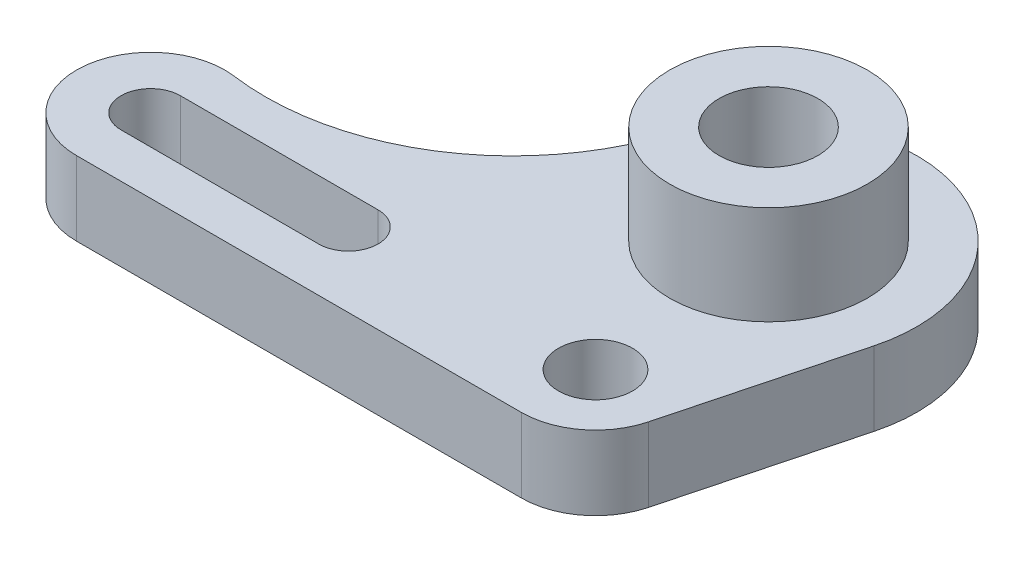
ISO-10303-21;
HEADER;
FILE_DESCRIPTION(('STEP AP214'),'2;1');
FILE_NAME('part.step','',(''),(''),'','','');
FILE_SCHEMA(('AUTOMOTIVE_DESIGN { 1 0 10303 214 1 1 1 1 }'));
ENDSEC;
DATA;
#1=APPLICATION_CONTEXT('core data for automotive mechanical design processes');
#2=APPLICATION_PROTOCOL_DEFINITION('international standard','automotive_design',2000,#1);
#3=PRODUCT_CONTEXT('',#1,'mechanical');
#4=PRODUCT('Part','Part','',(#3));
#5=PRODUCT_RELATED_PRODUCT_CATEGORY('part','',(#4));
#6=PRODUCT_DEFINITION_FORMATION('','',#4);
#7=PRODUCT_DEFINITION_CONTEXT('part definition',#1,'design');
#8=PRODUCT_DEFINITION('design','',#6,#7);
#9=PRODUCT_DEFINITION_SHAPE('','',#8);
#10=(LENGTH_UNIT() NAMED_UNIT(*) SI_UNIT(.MILLI.,.METRE.));
#11=(NAMED_UNIT(*) PLANE_ANGLE_UNIT() SI_UNIT($,.RADIAN.));
#12=(NAMED_UNIT(*) SI_UNIT($,.STERADIAN.) SOLID_ANGLE_UNIT());
#13=UNCERTAINTY_MEASURE_WITH_UNIT(LENGTH_MEASURE(1.E-05),#10,'distance_accuracy_value','');
#14=(GEOMETRIC_REPRESENTATION_CONTEXT(3) GLOBAL_UNCERTAINTY_ASSIGNED_CONTEXT((#13)) GLOBAL_UNIT_ASSIGNED_CONTEXT((#10,
#11,#12)) REPRESENTATION_CONTEXT('',''));
#15=CARTESIAN_POINT('',(0.,0.,0.));
#16=DIRECTION('',(0.,0.,1.));
#17=DIRECTION('',(1.,0.,0.));
#18=AXIS2_PLACEMENT_3D('',#15,#16,#17);
#19=CARTESIAN_POINT('',(-76.1882071883094,15.,-24.3999402751574));
#20=DIRECTION('',(0.,-1.,0.));
#21=DIRECTION('',(0.,0.,-1.));
#22=AXIS2_PLACEMENT_3D('',#19,#20,#21);
#23=CYLINDRICAL_SURFACE('',#22,50.);
#24=CARTESIAN_POINT('',(-76.1882071883094,0.,-24.3999402751574));
#25=DIRECTION('',(0.,-1.,0.));
#26=DIRECTION('',(0.,0.,1.));
#27=AXIS2_PLACEMENT_3D('',#24,#25,#26);
#28=CIRCLE('',#27,50.);
#29=CARTESIAN_POINT('',(-28.570577695616,0.,-9.14997760318404));
#30=VERTEX_POINT('',#29);
#31=CARTESIAN_POINT('',(-82.9665093511483,0.,25.1384753211175));
#32=VERTEX_POINT('',#31);
#33=EDGE_CURVE('E187',#30,#32,#28,.T.);
#34=ORIENTED_EDGE('',*,*,#33,.T.);
#35=DIRECTION('',(0.,-1.,0.));
#36=VECTOR('',#35,1.);
#37=CARTESIAN_POINT('',(-82.9665093511483,15.,25.1384753211175));
#38=LINE('',#37,#36);
#39=CARTESIAN_POINT('',(-82.9665093511483,15.,25.1384753211175));
#40=VERTEX_POINT('',#39);
#41=EDGE_CURVE('E53',#40,#32,#38,.T.);
#42=ORIENTED_EDGE('',*,*,#41,.F.);
#43=CARTESIAN_POINT('',(-76.1882071883094,15.,-24.3999402751574));
#44=DIRECTION('',(0.,-1.,0.));
#45=DIRECTION('',(0.,0.,1.));
#46=AXIS2_PLACEMENT_3D('',#43,#44,#45);
#47=CIRCLE('',#46,50.);
#48=CARTESIAN_POINT('',(-28.570577695616,15.,-9.14997760318404));
#49=VERTEX_POINT('',#48);
#50=EDGE_CURVE('E191',#49,#40,#47,.T.);
#51=ORIENTED_EDGE('',*,*,#50,.F.);
#52=DIRECTION('',(0.,-1.,0.));
#53=VECTOR('',#52,1.);
#54=CARTESIAN_POINT('',(-28.570577695616,15.,-9.14997760318404));
#55=LINE('',#54,#53);
#56=EDGE_CURVE('E211',#49,#30,#55,.T.);
#57=ORIENTED_EDGE('',*,*,#56,.T.);
#58=EDGE_LOOP('',(#34,#42,#51,#57));
#59=FACE_BOUND('',#58,.T.);
#60=ADVANCED_FACE('F45',(#59),#23,.F.);
#61=CARTESIAN_POINT('',(-85.,15.,40.));
#62=DIRECTION('',(0.,-1.,0.));
#63=DIRECTION('',(0.,0.,-1.));
#64=AXIS2_PLACEMENT_3D('',#61,#62,#63);
#65=CYLINDRICAL_SURFACE('',#64,15.);
#66=CARTESIAN_POINT('',(-85.,0.,40.));
#67=DIRECTION('',(0.,1.,0.));
#68=DIRECTION('',(0.,0.,1.));
#69=AXIS2_PLACEMENT_3D('',#66,#67,#68);
#70=CIRCLE('',#69,15.);
#71=CARTESIAN_POINT('',(-85.,0.,55.));
#72=VERTEX_POINT('',#71);
#73=EDGE_CURVE('E215',#32,#72,#70,.T.);
#74=ORIENTED_EDGE('',*,*,#73,.T.);
#75=DIRECTION('',(0.,-1.,0.));
#76=VECTOR('',#75,1.);
#77=CARTESIAN_POINT('',(-85.,15.,55.));
#78=LINE('',#77,#76);
#79=CARTESIAN_POINT('',(-85.,15.,55.));
#80=VERTEX_POINT('',#79);
#81=EDGE_CURVE('E244',#80,#72,#78,.T.);
#82=ORIENTED_EDGE('',*,*,#81,.F.);
#83=CARTESIAN_POINT('',(-85.,15.,40.));
#84=DIRECTION('',(0.,1.,0.));
#85=DIRECTION('',(0.,0.,1.));
#86=AXIS2_PLACEMENT_3D('',#83,#84,#85);
#87=CIRCLE('',#86,15.);
#88=EDGE_CURVE('E195',#40,#80,#87,.T.);
#89=ORIENTED_EDGE('',*,*,#88,.F.);
#90=ORIENTED_EDGE('',*,*,#41,.T.);
#91=EDGE_LOOP('',(#74,#82,#89,#90));
#92=FACE_BOUND('',#91,.T.);
#93=ADVANCED_FACE('F251',(#92),#65,.T.);
#94=CARTESIAN_POINT('',(-85.,15.,55.));
#95=DIRECTION('',(0.,0.,-1.));
#96=DIRECTION('',(-1.,0.,0.));
#97=AXIS2_PLACEMENT_3D('',#94,#95,#96);
#98=PLANE('',#97);
#99=DIRECTION('',(1.,0.,0.));
#100=VECTOR('',#99,1.);
#101=CARTESIAN_POINT('',(-85.,0.,55.));
#102=LINE('',#101,#100);
#103=CARTESIAN_POINT('',(5.00000000000001,0.,55.));
#104=VERTEX_POINT('',#103);
#105=EDGE_CURVE('E218',#72,#104,#102,.T.);
#106=ORIENTED_EDGE('',*,*,#105,.T.);
#107=DIRECTION('',(0.,-1.,0.));
#108=VECTOR('',#107,1.);
#109=CARTESIAN_POINT('',(5.00000000000001,15.,55.));
#110=LINE('',#109,#108);
#111=CARTESIAN_POINT('',(5.00000000000001,15.,55.));
#112=VERTEX_POINT('',#111);
#113=EDGE_CURVE('E240',#112,#104,#110,.T.);
#114=ORIENTED_EDGE('',*,*,#113,.F.);
#115=DIRECTION('',(1.,0.,0.));
#116=VECTOR('',#115,1.);
#117=CARTESIAN_POINT('',(-85.,15.,55.));
#118=LINE('',#117,#116);
#119=EDGE_CURVE('E199',#80,#112,#118,.T.);
#120=ORIENTED_EDGE('',*,*,#119,.F.);
#121=ORIENTED_EDGE('',*,*,#81,.T.);
#122=EDGE_LOOP('',(#106,#114,#120,#121));
#123=FACE_BOUND('',#122,.T.);
#124=ADVANCED_FACE('F264',(#123),#98,.F.);
#125=CARTESIAN_POINT('',(5.00000000000001,15.,40.));
#126=DIRECTION('',(0.,-1.,0.));
#127=DIRECTION('',(0.,0.,-1.));
#128=AXIS2_PLACEMENT_3D('',#125,#126,#127);
#129=CYLINDRICAL_SURFACE('',#128,15.);
#130=CARTESIAN_POINT('',(5.00000000000001,0.,40.));
#131=DIRECTION('',(0.,1.,0.));
#132=DIRECTION('',(0.,0.,1.));
#133=AXIS2_PLACEMENT_3D('',#130,#131,#132);
#134=CIRCLE('',#133,15.);
#135=CARTESIAN_POINT('',(19.507658043473,0.,43.8115427445659));
#136=VERTEX_POINT('',#135);
#137=EDGE_CURVE('E221',#104,#136,#134,.T.);
#138=ORIENTED_EDGE('',*,*,#137,.T.);
#139=DIRECTION('',(0.,-1.,0.));
#140=VECTOR('',#139,1.);
#141=CARTESIAN_POINT('',(19.507658043473,15.,43.8115427445659));
#142=LINE('',#141,#140);
#143=CARTESIAN_POINT('',(19.507658043473,15.,43.8115427445659));
#144=VERTEX_POINT('',#143);
#145=EDGE_CURVE('E236',#144,#136,#142,.T.);
#146=ORIENTED_EDGE('',*,*,#145,.F.);
#147=CARTESIAN_POINT('',(5.00000000000001,15.,40.));
#148=DIRECTION('',(0.,1.,0.));
#149=DIRECTION('',(0.,0.,1.));
#150=AXIS2_PLACEMENT_3D('',#147,#148,#149);
#151=CIRCLE('',#150,15.);
#152=EDGE_CURVE('E202',#112,#144,#151,.T.);
#153=ORIENTED_EDGE('',*,*,#152,.F.);
#154=ORIENTED_EDGE('',*,*,#113,.T.);
#155=EDGE_LOOP('',(#138,#146,#153,#154));
#156=FACE_BOUND('',#155,.T.);
#157=ADVANCED_FACE('F268',(#156),#129,.T.);
#158=CARTESIAN_POINT('',(29.015316086946,15.,7.62308548913174));
#159=DIRECTION('',(-0.967177202898201,0.,-0.254102849637725));
#160=DIRECTION('',(-0.254102849637725,0.,0.967177202898201));
#161=AXIS2_PLACEMENT_3D('',#158,#159,#160);
#162=PLANE('',#161);
#163=DIRECTION('',(0.254102849637725,0.,-0.967177202898201));
#164=VECTOR('',#163,1.);
#165=CARTESIAN_POINT('',(29.015316086946,0.,7.62308548913174));
#166=LINE('',#165,#164);
#167=CARTESIAN_POINT('',(29.015316086946,0.,7.62308548913174));
#168=VERTEX_POINT('',#167);
#169=EDGE_CURVE('E224',#136,#168,#166,.T.);
#170=ORIENTED_EDGE('',*,*,#169,.T.);
#171=DIRECTION('',(0.,-1.,0.));
#172=VECTOR('',#171,1.);
#173=CARTESIAN_POINT('',(29.015316086946,15.,7.62308548913174));
#174=LINE('',#173,#172);
#175=CARTESIAN_POINT('',(29.015316086946,15.,7.62308548913174));
#176=VERTEX_POINT('',#175);
#177=EDGE_CURVE('E232',#176,#168,#174,.T.);
#178=ORIENTED_EDGE('',*,*,#177,.F.);
#179=DIRECTION('',(0.254102849637725,0.,-0.967177202898201));
#180=VECTOR('',#179,1.);
#181=CARTESIAN_POINT('',(29.015316086946,15.,7.62308548913174));
#182=LINE('',#181,#180);
#183=EDGE_CURVE('E205',#144,#176,#182,.T.);
#184=ORIENTED_EDGE('',*,*,#183,.F.);
#185=ORIENTED_EDGE('',*,*,#145,.T.);
#186=EDGE_LOOP('',(#170,#178,#184,#185));
#187=FACE_BOUND('',#186,.T.);
#188=ADVANCED_FACE('F278',(#187),#162,.F.);
#189=CARTESIAN_POINT('',(0.,15.,0.));
#190=DIRECTION('',(0.,-1.,0.));
#191=DIRECTION('',(0.,0.,-1.));
#192=AXIS2_PLACEMENT_3D('',#189,#190,#191);
#193=CYLINDRICAL_SURFACE('',#192,30.);
#194=CARTESIAN_POINT('',(0.,0.,0.));
#195=DIRECTION('',(0.,1.,0.));
#196=DIRECTION('',(0.,0.,1.));
#197=AXIS2_PLACEMENT_3D('',#194,#195,#196);
#198=CIRCLE('',#197,30.);
#199=EDGE_CURVE('E196',#168,#30,#198,.T.);
#200=ORIENTED_EDGE('',*,*,#199,.T.);
#201=ORIENTED_EDGE('',*,*,#56,.F.);
#202=CARTESIAN_POINT('',(0.,15.,0.));
#203=DIRECTION('',(0.,1.,0.));
#204=DIRECTION('',(0.,0.,1.));
#205=AXIS2_PLACEMENT_3D('',#202,#203,#204);
#206=CIRCLE('',#205,30.);
#207=EDGE_CURVE('E208',#176,#49,#206,.T.);
#208=ORIENTED_EDGE('',*,*,#207,.F.);
#209=ORIENTED_EDGE('',*,*,#177,.T.);
#210=EDGE_LOOP('',(#200,#201,#208,#209));
#211=FACE_BOUND('',#210,.T.);
#212=ADVANCED_FACE('F276',(#211),#193,.T.);
#213=CARTESIAN_POINT('',(-76.1882071883094,15.,-24.3999402751574));
#214=DIRECTION('',(0.,1.,0.));
#215=DIRECTION('',(0.,0.,1.));
#216=AXIS2_PLACEMENT_3D('',#213,#214,#215);
#217=PLANE('',#216);
#218=CARTESIAN_POINT('',(-85.,15.,40.));
#219=DIRECTION('',(0.,1.,0.));
#220=DIRECTION('',(0.,0.,1.));
#221=AXIS2_PLACEMENT_3D('',#218,#219,#220);
#222=CIRCLE('',#221,6.);
#223=CARTESIAN_POINT('',(-85.,15.,34.));
#224=VERTEX_POINT('',#223);
#225=CARTESIAN_POINT('',(-85.,15.,46.));
#226=VERTEX_POINT('',#225);
#227=EDGE_CURVE('E60',#224,#226,#222,.T.);
#228=ORIENTED_EDGE('',*,*,#227,.F.);
#229=DIRECTION('',(-1.,0.,0.));
#230=VECTOR('',#229,1.);
#231=CARTESIAN_POINT('',(-85.,15.,34.));
#232=LINE('',#231,#230);
#233=CARTESIAN_POINT('',(-45.,15.,34.));
#234=VERTEX_POINT('',#233);
#235=EDGE_CURVE('E143',#234,#224,#232,.T.);
#236=ORIENTED_EDGE('',*,*,#235,.F.);
#237=CARTESIAN_POINT('',(-45.,15.,40.));
#238=DIRECTION('',(0.,1.,0.));
#239=DIRECTION('',(0.,0.,1.));
#240=AXIS2_PLACEMENT_3D('',#237,#238,#239);
#241=CIRCLE('',#240,6.);
#242=CARTESIAN_POINT('',(-45.,15.,46.));
#243=VERTEX_POINT('',#242);
#244=EDGE_CURVE('E147',#243,#234,#241,.T.);
#245=ORIENTED_EDGE('',*,*,#244,.F.);
#246=DIRECTION('',(1.,0.,0.));
#247=VECTOR('',#246,1.);
#248=CARTESIAN_POINT('',(-85.,15.,46.));
#249=LINE('',#248,#247);
#250=EDGE_CURVE('E156',#226,#243,#249,.T.);
#251=ORIENTED_EDGE('',*,*,#250,.F.);
#252=EDGE_LOOP('',(#228,#236,#245,#251));
#253=FACE_BOUND('',#252,.T.);
#254=CARTESIAN_POINT('',(5.00000000000001,15.,40.));
#255=DIRECTION('',(0.,1.,0.));
#256=DIRECTION('',(0.,0.,1.));
#257=AXIS2_PLACEMENT_3D('',#254,#255,#256);
#258=CIRCLE('',#257,7.5);
#259=CARTESIAN_POINT('',(5.00000000000001,15.,47.5));
#260=VERTEX_POINT('',#259);
#261=EDGE_CURVE('E165',#260,#260,#258,.T.);
#262=ORIENTED_EDGE('',*,*,#261,.F.);
#263=EDGE_LOOP('',(#262));
#264=FACE_BOUND('',#263,.T.);
#265=CARTESIAN_POINT('',(0.,15.,0.));
#266=DIRECTION('',(0.,1.,0.));
#267=DIRECTION('',(0.,0.,1.));
#268=AXIS2_PLACEMENT_3D('',#265,#266,#267);
#269=CIRCLE('',#268,20.);
#270=CARTESIAN_POINT('',(0.,15.,20.));
#271=VERTEX_POINT('',#270);
#272=EDGE_CURVE('E182',#271,#271,#269,.T.);
#273=ORIENTED_EDGE('',*,*,#272,.F.);
#274=EDGE_LOOP('',(#273));
#275=FACE_BOUND('',#274,.T.);
#276=ORIENTED_EDGE('',*,*,#50,.T.);
#277=ORIENTED_EDGE('',*,*,#88,.T.);
#278=ORIENTED_EDGE('',*,*,#119,.T.);
#279=ORIENTED_EDGE('',*,*,#152,.T.);
#280=ORIENTED_EDGE('',*,*,#183,.T.);
#281=ORIENTED_EDGE('',*,*,#207,.T.);
#282=EDGE_LOOP('',(#276,#277,#278,#279,#280,#281));
#283=FACE_BOUND('',#282,.T.);
#284=ADVANCED_FACE('F272',(#253,#264,#275,#283),#217,.T.);
#285=CARTESIAN_POINT('',(-76.1882071883094,0.,-24.3999402751574));
#286=DIRECTION('',(0.,1.,0.));
#287=DIRECTION('',(0.,0.,1.));
#288=AXIS2_PLACEMENT_3D('',#285,#286,#287);
#289=PLANE('',#288);
#290=DIRECTION('',(-1.,0.,0.));
#291=VECTOR('',#290,1.);
#292=CARTESIAN_POINT('',(-85.,0.,34.));
#293=LINE('',#292,#291);
#294=CARTESIAN_POINT('',(-45.,0.,34.));
#295=VERTEX_POINT('',#294);
#296=CARTESIAN_POINT('',(-85.,0.,34.));
#297=VERTEX_POINT('',#296);
#298=EDGE_CURVE('E131',#295,#297,#293,.T.);
#299=ORIENTED_EDGE('',*,*,#298,.T.);
#300=CARTESIAN_POINT('',(-85.,0.,40.));
#301=DIRECTION('',(0.,1.,0.));
#302=DIRECTION('',(0.,0.,1.));
#303=AXIS2_PLACEMENT_3D('',#300,#301,#302);
#304=CIRCLE('',#303,6.);
#305=CARTESIAN_POINT('',(-85.,0.,46.));
#306=VERTEX_POINT('',#305);
#307=EDGE_CURVE('E124',#297,#306,#304,.T.);
#308=ORIENTED_EDGE('',*,*,#307,.T.);
#309=DIRECTION('',(1.,0.,0.));
#310=VECTOR('',#309,1.);
#311=CARTESIAN_POINT('',(-85.,0.,46.));
#312=LINE('',#311,#310);
#313=CARTESIAN_POINT('',(-45.,0.,46.));
#314=VERTEX_POINT('',#313);
#315=EDGE_CURVE('E134',#306,#314,#312,.T.);
#316=ORIENTED_EDGE('',*,*,#315,.T.);
#317=CARTESIAN_POINT('',(-45.,0.,40.));
#318=DIRECTION('',(0.,1.,0.));
#319=DIRECTION('',(0.,0.,1.));
#320=AXIS2_PLACEMENT_3D('',#317,#318,#319);
#321=CIRCLE('',#320,6.);
#322=EDGE_CURVE('E68',#314,#295,#321,.T.);
#323=ORIENTED_EDGE('',*,*,#322,.T.);
#324=EDGE_LOOP('',(#299,#308,#316,#323));
#325=FACE_BOUND('',#324,.T.);
#326=CARTESIAN_POINT('',(5.00000000000001,0.,40.));
#327=DIRECTION('',(0.,1.,0.));
#328=DIRECTION('',(0.,0.,1.));
#329=AXIS2_PLACEMENT_3D('',#326,#327,#328);
#330=CIRCLE('',#329,7.5);
#331=CARTESIAN_POINT('',(5.00000000000001,0.,47.5));
#332=VERTEX_POINT('',#331);
#333=EDGE_CURVE('E171',#332,#332,#330,.T.);
#334=ORIENTED_EDGE('',*,*,#333,.T.);
#335=EDGE_LOOP('',(#334));
#336=FACE_BOUND('',#335,.T.);
#337=ORIENTED_EDGE('',*,*,#33,.F.);
#338=ORIENTED_EDGE('',*,*,#199,.F.);
#339=ORIENTED_EDGE('',*,*,#169,.F.);
#340=ORIENTED_EDGE('',*,*,#137,.F.);
#341=ORIENTED_EDGE('',*,*,#105,.F.);
#342=ORIENTED_EDGE('',*,*,#73,.F.);
#343=EDGE_LOOP('',(#337,#338,#339,#340,#341,#342));
#344=FACE_BOUND('',#343,.T.);
#345=ADVANCED_FACE('F139',(#325,#336,#344),#289,.F.);
#346=CARTESIAN_POINT('',(0.,35.,0.));
#347=DIRECTION('',(0.,1.,0.));
#348=DIRECTION('',(0.,0.,1.));
#349=AXIS2_PLACEMENT_3D('',#346,#347,#348);
#350=PLANE('',#349);
#351=CARTESIAN_POINT('',(0.,35.,0.));
#352=DIRECTION('',(0.,1.,0.));
#353=DIRECTION('',(0.,0.,1.));
#354=AXIS2_PLACEMENT_3D('',#351,#352,#353);
#355=CIRCLE('',#354,20.);
#356=CARTESIAN_POINT('',(0.,35.,20.));
#357=VERTEX_POINT('',#356);
#358=EDGE_CURVE('E183',#357,#357,#355,.T.);
#359=ORIENTED_EDGE('',*,*,#358,.T.);
#360=EDGE_LOOP('',(#359));
#361=FACE_BOUND('',#360,.T.);
#362=CARTESIAN_POINT('',(0.,35.,0.));
#363=DIRECTION('',(0.,1.,0.));
#364=DIRECTION('',(0.,0.,1.));
#365=AXIS2_PLACEMENT_3D('',#362,#363,#364);
#366=CIRCLE('',#365,10.);
#367=CARTESIAN_POINT('',(0.,35.,10.));
#368=VERTEX_POINT('',#367);
#369=EDGE_CURVE('E175',#368,#368,#366,.T.);
#370=ORIENTED_EDGE('',*,*,#369,.F.);
#371=EDGE_LOOP('',(#370));
#372=FACE_BOUND('',#371,.T.);
#373=ADVANCED_FACE('F334',(#361,#372),#350,.T.);
#374=CARTESIAN_POINT('',(0.,35.,0.));
#375=DIRECTION('',(0.,-1.,0.));
#376=DIRECTION('',(0.,0.,-1.));
#377=AXIS2_PLACEMENT_3D('',#374,#375,#376);
#378=CYLINDRICAL_SURFACE('',#377,20.);
#379=ORIENTED_EDGE('',*,*,#358,.F.);
#380=EDGE_LOOP('',(#379));
#381=FACE_BOUND('',#380,.T.);
#382=ORIENTED_EDGE('',*,*,#272,.T.);
#383=EDGE_LOOP('',(#382));
#384=FACE_BOUND('',#383,.T.);
#385=ADVANCED_FACE('F352',(#381,#384),#378,.T.);
#386=CARTESIAN_POINT('',(0.,35.,0.));
#387=DIRECTION('',(0.,-1.,0.));
#388=DIRECTION('',(0.,0.,-1.));
#389=AXIS2_PLACEMENT_3D('',#386,#387,#388);
#390=CYLINDRICAL_SURFACE('',#389,10.);
#391=ORIENTED_EDGE('',*,*,#369,.T.);
#392=EDGE_LOOP('',(#391));
#393=FACE_BOUND('',#392,.T.);
#394=CARTESIAN_POINT('',(0.,15.,0.));
#395=DIRECTION('',(0.,1.,0.));
#396=DIRECTION('',(0.,0.,1.));
#397=AXIS2_PLACEMENT_3D('',#394,#395,#396);
#398=CIRCLE('',#397,10.);
#399=CARTESIAN_POINT('',(0.,15.,10.));
#400=VERTEX_POINT('',#399);
#401=EDGE_CURVE('E11',#400,#400,#398,.F.);
#402=ORIENTED_EDGE('',*,*,#401,.T.);
#403=EDGE_LOOP('',(#402));
#404=FACE_BOUND('',#403,.T.);
#405=ADVANCED_FACE('F345',(#393,#404),#390,.F.);
#406=ORIENTED_EDGE('',*,*,#401,.F.);
#407=EDGE_LOOP('',(#406));
#408=FACE_BOUND('',#407,.T.);
#409=ADVANCED_FACE('F325',(#408),#217,.T.);
#410=CARTESIAN_POINT('',(5.00000000000001,0.,40.));
#411=DIRECTION('',(0.,1.,0.));
#412=DIRECTION('',(0.,0.,1.));
#413=AXIS2_PLACEMENT_3D('',#410,#411,#412);
#414=CYLINDRICAL_SURFACE('',#413,7.5);
#415=ORIENTED_EDGE('',*,*,#333,.F.);
#416=EDGE_LOOP('',(#415));
#417=FACE_BOUND('',#416,.T.);
#418=ORIENTED_EDGE('',*,*,#261,.T.);
#419=EDGE_LOOP('',(#418));
#420=FACE_BOUND('',#419,.T.);
#421=ADVANCED_FACE('F344',(#417,#420),#414,.F.);
#422=CARTESIAN_POINT('',(-85.,0.,40.));
#423=DIRECTION('',(0.,1.,0.));
#424=DIRECTION('',(0.,0.,1.));
#425=AXIS2_PLACEMENT_3D('',#422,#423,#424);
#426=CYLINDRICAL_SURFACE('',#425,6.);
#427=ORIENTED_EDGE('',*,*,#227,.T.);
#428=DIRECTION('',(0.,1.,0.));
#429=VECTOR('',#428,1.);
#430=CARTESIAN_POINT('',(-85.,0.,46.));
#431=LINE('',#430,#429);
#432=EDGE_CURVE('E120',#306,#226,#431,.T.);
#433=ORIENTED_EDGE('',*,*,#432,.F.);
#434=ORIENTED_EDGE('',*,*,#307,.F.);
#435=DIRECTION('',(0.,1.,0.));
#436=VECTOR('',#435,1.);
#437=CARTESIAN_POINT('',(-85.,0.,34.));
#438=LINE('',#437,#436);
#439=EDGE_CURVE('E162',#297,#224,#438,.T.);
#440=ORIENTED_EDGE('',*,*,#439,.T.);
#441=EDGE_LOOP('',(#427,#433,#434,#440));
#442=FACE_BOUND('',#441,.T.);
#443=ADVANCED_FACE('F122',(#442),#426,.F.);
#444=CARTESIAN_POINT('',(-85.,0.,34.));
#445=DIRECTION('',(0.,0.,-1.));
#446=DIRECTION('',(-1.,0.,0.));
#447=AXIS2_PLACEMENT_3D('',#444,#445,#446);
#448=PLANE('',#447);
#449=ORIENTED_EDGE('',*,*,#235,.T.);
#450=ORIENTED_EDGE('',*,*,#439,.F.);
#451=ORIENTED_EDGE('',*,*,#298,.F.);
#452=DIRECTION('',(0.,1.,0.));
#453=VECTOR('',#452,1.);
#454=CARTESIAN_POINT('',(-45.,0.,34.));
#455=LINE('',#454,#453);
#456=EDGE_CURVE('E166',#295,#234,#455,.T.);
#457=ORIENTED_EDGE('',*,*,#456,.T.);
#458=EDGE_LOOP('',(#449,#450,#451,#457));
#459=FACE_BOUND('',#458,.T.);
#460=ADVANCED_FACE('F387',(#459),#448,.F.);
#461=CARTESIAN_POINT('',(-45.,0.,40.));
#462=DIRECTION('',(0.,1.,0.));
#463=DIRECTION('',(0.,0.,1.));
#464=AXIS2_PLACEMENT_3D('',#461,#462,#463);
#465=CYLINDRICAL_SURFACE('',#464,6.);
#466=ORIENTED_EDGE('',*,*,#244,.T.);
#467=ORIENTED_EDGE('',*,*,#456,.F.);
#468=ORIENTED_EDGE('',*,*,#322,.F.);
#469=DIRECTION('',(0.,1.,0.));
#470=VECTOR('',#469,1.);
#471=CARTESIAN_POINT('',(-45.,0.,46.));
#472=LINE('',#471,#470);
#473=EDGE_CURVE('E130',#314,#243,#472,.T.);
#474=ORIENTED_EDGE('',*,*,#473,.T.);
#475=EDGE_LOOP('',(#466,#467,#468,#474));
#476=FACE_BOUND('',#475,.T.);
#477=ADVANCED_FACE('F396',(#476),#465,.F.);
#478=CARTESIAN_POINT('',(-85.,0.,46.));
#479=DIRECTION('',(0.,0.,1.));
#480=DIRECTION('',(1.,0.,0.));
#481=AXIS2_PLACEMENT_3D('',#478,#479,#480);
#482=PLANE('',#481);
#483=ORIENTED_EDGE('',*,*,#250,.T.);
#484=ORIENTED_EDGE('',*,*,#473,.F.);
#485=ORIENTED_EDGE('',*,*,#315,.F.);
#486=ORIENTED_EDGE('',*,*,#432,.T.);
#487=EDGE_LOOP('',(#483,#484,#485,#486));
#488=FACE_BOUND('',#487,.T.);
#489=ADVANCED_FACE('F135',(#488),#482,.F.);
#490=CLOSED_SHELL('',(#60,#93,#124,#157,#188,#212,#284,#345,#373,#385,#405,#409,#421,#443,#460,
#477,#489));
#491=MANIFOLD_SOLID_BREP('B2',#490);
#492=ADVANCED_BREP_SHAPE_REPRESENTATION('',(#18,#491),#14);
#493=SHAPE_DEFINITION_REPRESENTATION(#9,#492);
ENDSEC;
END-ISO-10303-21;
